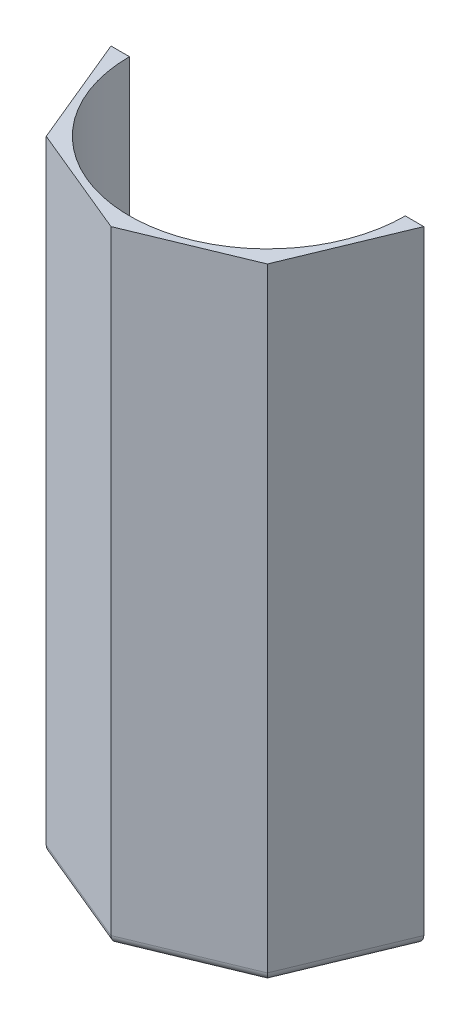
ISO-10303-21;
HEADER;
FILE_DESCRIPTION(('STEP AP214'),'2;1');
FILE_NAME('part.step','',(''),(''),'','','');
FILE_SCHEMA(('AUTOMOTIVE_DESIGN { 1 0 10303 214 1 1 1 1 }'));
ENDSEC;
DATA;
#1=APPLICATION_CONTEXT('core data for automotive mechanical design processes');
#2=APPLICATION_PROTOCOL_DEFINITION('international standard','automotive_design',2000,#1);
#3=PRODUCT_CONTEXT('',#1,'mechanical');
#4=PRODUCT('Part','Part','',(#3));
#5=PRODUCT_RELATED_PRODUCT_CATEGORY('part','',(#4));
#6=PRODUCT_DEFINITION_FORMATION('','',#4);
#7=PRODUCT_DEFINITION_CONTEXT('part definition',#1,'design');
#8=PRODUCT_DEFINITION('design','',#6,#7);
#9=PRODUCT_DEFINITION_SHAPE('','',#8);
#10=(LENGTH_UNIT() NAMED_UNIT(*) SI_UNIT(.MILLI.,.METRE.));
#11=(NAMED_UNIT(*) PLANE_ANGLE_UNIT() SI_UNIT($,.RADIAN.));
#12=(NAMED_UNIT(*) SI_UNIT($,.STERADIAN.) SOLID_ANGLE_UNIT());
#13=UNCERTAINTY_MEASURE_WITH_UNIT(LENGTH_MEASURE(1.E-05),#10,'distance_accuracy_value','');
#14=(GEOMETRIC_REPRESENTATION_CONTEXT(3) GLOBAL_UNCERTAINTY_ASSIGNED_CONTEXT((#13)) GLOBAL_UNIT_ASSIGNED_CONTEXT((#10,
#11,#12)) REPRESENTATION_CONTEXT('',''));
#15=CARTESIAN_POINT('',(0.,0.,0.));
#16=DIRECTION('',(0.,0.,1.));
#17=DIRECTION('',(1.,0.,0.));
#18=AXIS2_PLACEMENT_3D('',#15,#16,#17);
#19=CARTESIAN_POINT('',(24.8548033587074,140.,24.8548033587069));
#20=DIRECTION('',(-0.923879532511291,0.,-0.382683432365079));
#21=DIRECTION('',(-0.382683432365079,0.,0.923879532511291));
#22=AXIS2_PLACEMENT_3D('',#19,#20,#21);
#23=PLANE('',#22);
#24=DIRECTION('',(0.,-1.,0.));
#25=VECTOR('',#24,1.);
#26=CARTESIAN_POINT('',(24.8548033587074,140.,24.8548033587069));
#27=LINE('',#26,#25);
#28=CARTESIAN_POINT('',(24.8548033587074,140.,24.8548033587069));
#29=VERTEX_POINT('',#28);
#30=CARTESIAN_POINT('',(24.8548033587074,2.,24.8548033587069));
#31=VERTEX_POINT('',#30);
#32=EDGE_CURVE('E151',#29,#31,#27,.T.);
#33=ORIENTED_EDGE('',*,*,#32,.T.);
#34=DIRECTION('',(0.382683432365079,0.,-0.923879532511291));
#35=VECTOR('',#34,1.);
#36=CARTESIAN_POINT('',(24.8548033587074,2.,24.8548033587069));
#37=LINE('',#36,#35);
#38=CARTESIAN_POINT('',(35.15,2.,-4.05925293378573E-13));
#39=VERTEX_POINT('',#38);
#40=EDGE_CURVE('E176',#31,#39,#37,.T.);
#41=ORIENTED_EDGE('',*,*,#40,.T.);
#42=DIRECTION('',(0.,-1.,0.));
#43=VECTOR('',#42,1.);
#44=CARTESIAN_POINT('',(35.15,140.,-4.05925293378573E-13));
#45=LINE('',#44,#43);
#46=CARTESIAN_POINT('',(35.15,140.,-4.05925293378573E-13));
#47=VERTEX_POINT('',#46);
#48=EDGE_CURVE('E56',#47,#39,#45,.T.);
#49=ORIENTED_EDGE('',*,*,#48,.F.);
#50=DIRECTION('',(0.382683432365079,0.,-0.923879532511291));
#51=VECTOR('',#50,1.);
#52=CARTESIAN_POINT('',(24.8548033587074,140.,24.8548033587069));
#53=LINE('',#52,#51);
#54=EDGE_CURVE('E141',#29,#47,#53,.T.);
#55=ORIENTED_EDGE('',*,*,#54,.F.);
#56=EDGE_LOOP('',(#33,#41,#49,#55));
#57=FACE_BOUND('',#56,.T.);
#58=ADVANCED_FACE('F33',(#57),#23,.F.);
#59=CARTESIAN_POINT('',(-35.15,140.,3.9676378502107E-13));
#60=DIRECTION('',(0.923879532511282,0.,-0.3826834323651));
#61=DIRECTION('',(-0.3826834323651,0.,-0.923879532511282));
#62=AXIS2_PLACEMENT_3D('',#59,#60,#61);
#63=PLANE('',#62);
#64=DIRECTION('',(0.,-1.,0.));
#65=VECTOR('',#64,1.);
#66=CARTESIAN_POINT('',(-35.15,140.,3.9676378502107E-13));
#67=LINE('',#66,#65);
#68=CARTESIAN_POINT('',(-35.15,140.,3.9676378502107E-13));
#69=VERTEX_POINT('',#68);
#70=CARTESIAN_POINT('',(-35.15,2.,3.96815807153772E-13));
#71=VERTEX_POINT('',#70);
#72=EDGE_CURVE('E119',#69,#71,#67,.T.);
#73=ORIENTED_EDGE('',*,*,#72,.T.);
#74=DIRECTION('',(0.3826834323651,0.,0.923879532511282));
#75=VECTOR('',#74,1.);
#76=CARTESIAN_POINT('',(-35.15,2.,3.9676378502107E-13));
#77=LINE('',#76,#75);
#78=CARTESIAN_POINT('',(-24.8548033587068,2.,24.8548033587074));
#79=VERTEX_POINT('',#78);
#80=EDGE_CURVE('E11',#71,#79,#77,.T.);
#81=ORIENTED_EDGE('',*,*,#80,.T.);
#82=DIRECTION('',(0.,-1.,0.));
#83=VECTOR('',#82,1.);
#84=CARTESIAN_POINT('',(-24.8548033587068,140.,24.8548033587074));
#85=LINE('',#84,#83);
#86=CARTESIAN_POINT('',(-24.8548033587068,140.,24.8548033587074));
#87=VERTEX_POINT('',#86);
#88=EDGE_CURVE('E126',#87,#79,#85,.T.);
#89=ORIENTED_EDGE('',*,*,#88,.F.);
#90=DIRECTION('',(0.3826834323651,0.,0.923879532511282));
#91=VECTOR('',#90,1.);
#92=CARTESIAN_POINT('',(-35.15,140.,3.9676378502107E-13));
#93=LINE('',#92,#91);
#94=EDGE_CURVE('E131',#69,#87,#93,.T.);
#95=ORIENTED_EDGE('',*,*,#94,.F.);
#96=EDGE_LOOP('',(#73,#81,#89,#95));
#97=FACE_BOUND('',#96,.T.);
#98=ADVANCED_FACE('F138',(#97),#63,.F.);
#99=CARTESIAN_POINT('',(-24.8548033587068,140.,24.8548033587074));
#100=DIRECTION('',(0.382683432365079,0.,-0.923879532511291));
#101=DIRECTION('',(-0.923879532511291,0.,-0.382683432365079));
#102=AXIS2_PLACEMENT_3D('',#99,#100,#101);
#103=PLANE('',#102);
#104=ORIENTED_EDGE('',*,*,#88,.T.);
#105=DIRECTION('',(0.923879532511291,0.,0.382683432365079));
#106=VECTOR('',#105,1.);
#107=CARTESIAN_POINT('',(-24.8548033587068,2.,24.8548033587074));
#108=LINE('',#107,#106);
#109=CARTESIAN_POINT('',(4.02455846426619E-13,2.,35.15));
#110=VERTEX_POINT('',#109);
#111=EDGE_CURVE('E42',#79,#110,#108,.T.);
#112=ORIENTED_EDGE('',*,*,#111,.T.);
#113=DIRECTION('',(0.,-1.,0.));
#114=VECTOR('',#113,1.);
#115=CARTESIAN_POINT('',(4.02455846426619E-13,140.,35.15));
#116=LINE('',#115,#114);
#117=CARTESIAN_POINT('',(4.02455846426619E-13,140.,35.15));
#118=VERTEX_POINT('',#117);
#119=EDGE_CURVE('E154',#118,#110,#116,.T.);
#120=ORIENTED_EDGE('',*,*,#119,.F.);
#121=DIRECTION('',(0.923879532511291,0.,0.382683432365079));
#122=VECTOR('',#121,1.);
#123=CARTESIAN_POINT('',(-24.8548033587068,140.,24.8548033587074));
#124=LINE('',#123,#122);
#125=EDGE_CURVE('E140',#87,#118,#124,.T.);
#126=ORIENTED_EDGE('',*,*,#125,.F.);
#127=EDGE_LOOP('',(#104,#112,#120,#126));
#128=FACE_BOUND('',#127,.T.);
#129=ADVANCED_FACE('F243',(#128),#103,.F.);
#130=CARTESIAN_POINT('',(4.02455846426619E-13,140.,35.15));
#131=DIRECTION('',(-0.3826834323651,0.,-0.923879532511283));
#132=DIRECTION('',(-0.923879532511283,0.,0.3826834323651));
#133=AXIS2_PLACEMENT_3D('',#130,#131,#132);
#134=PLANE('',#133);
#135=ORIENTED_EDGE('',*,*,#119,.T.);
#136=DIRECTION('',(0.923879532511283,0.,-0.3826834323651));
#137=VECTOR('',#136,1.);
#138=CARTESIAN_POINT('',(4.02455846426619E-13,2.,35.15));
#139=LINE('',#138,#137);
#140=EDGE_CURVE('E159',#110,#31,#139,.T.);
#141=ORIENTED_EDGE('',*,*,#140,.T.);
#142=ORIENTED_EDGE('',*,*,#32,.F.);
#143=DIRECTION('',(0.923879532511283,0.,-0.3826834323651));
#144=VECTOR('',#143,1.);
#145=CARTESIAN_POINT('',(4.02455846426619E-13,140.,35.15));
#146=LINE('',#145,#144);
#147=EDGE_CURVE('E143',#118,#29,#146,.T.);
#148=ORIENTED_EDGE('',*,*,#147,.F.);
#149=EDGE_LOOP('',(#135,#141,#142,#148));
#150=FACE_BOUND('',#149,.T.);
#151=ADVANCED_FACE('F294',(#150),#134,.F.);
#152=CARTESIAN_POINT('',(0.,140.,0.));
#153=DIRECTION('',(0.,1.,0.));
#154=DIRECTION('',(0.,0.,1.));
#155=AXIS2_PLACEMENT_3D('',#152,#153,#154);
#156=PLANE('',#155);
#157=DIRECTION('',(1.,0.,0.));
#158=VECTOR('',#157,1.);
#159=CARTESIAN_POINT('',(-35.15,140.,3.9676378502107E-13));
#160=LINE('',#159,#158);
#161=CARTESIAN_POINT('',(-31.,140.,3.49378867875146E-13));
#162=VERTEX_POINT('',#161);
#163=EDGE_CURVE('E122',#69,#162,#160,.T.);
#164=ORIENTED_EDGE('',*,*,#163,.F.);
#165=ORIENTED_EDGE('',*,*,#94,.T.);
#166=ORIENTED_EDGE('',*,*,#125,.T.);
#167=ORIENTED_EDGE('',*,*,#147,.T.);
#168=ORIENTED_EDGE('',*,*,#54,.T.);
#169=CARTESIAN_POINT('',(31.,140.,-3.58540376232648E-13));
#170=VERTEX_POINT('',#169);
#171=EDGE_CURVE('E136',#170,#47,#160,.T.);
#172=ORIENTED_EDGE('',*,*,#171,.F.);
#173=CARTESIAN_POINT('',(0.,140.,0.));
#174=DIRECTION('',(0.,1.,0.));
#175=DIRECTION('',(0.,0.,1.));
#176=AXIS2_PLACEMENT_3D('',#173,#174,#175);
#177=CIRCLE('',#176,31.);
#178=EDGE_CURVE('E134',#162,#170,#177,.T.);
#179=ORIENTED_EDGE('',*,*,#178,.F.);
#180=EDGE_LOOP('',(#164,#165,#166,#167,#168,#172,#179));
#181=FACE_BOUND('',#180,.T.);
#182=ADVANCED_FACE('F130',(#181),#156,.T.);
#183=CARTESIAN_POINT('',(0.,0.,0.));
#184=DIRECTION('',(0.,1.,0.));
#185=DIRECTION('',(0.,0.,1.));
#186=AXIS2_PLACEMENT_3D('',#183,#184,#185);
#187=PLANE('',#186);
#188=DIRECTION('',(0.3826834323651,0.,0.923879532511282));
#189=VECTOR('',#188,1.);
#190=CARTESIAN_POINT('',(-28.1546426143309,0.,11.6620348146237));
#191=LINE('',#190,#189);
#192=CARTESIAN_POINT('',(-23.3240696292465,0.,23.3240696292471));
#193=VERTEX_POINT('',#192);
#194=CARTESIAN_POINT('',(-32.9852155994152,0.,3.68518255460775E-13));
#195=VERTEX_POINT('',#194);
#196=EDGE_CURVE('E166',#193,#195,#191,.F.);
#197=ORIENTED_EDGE('',*,*,#196,.T.);
#198=DIRECTION('',(1.,0.,0.));
#199=VECTOR('',#198,1.);
#200=CARTESIAN_POINT('',(0.,0.,0.));
#201=LINE('',#200,#199);
#202=CARTESIAN_POINT('',(-26.,0.,2.92288606253549E-13));
#203=VERTEX_POINT('',#202);
#204=EDGE_CURVE('E214',#195,#203,#201,.T.);
#205=ORIENTED_EDGE('',*,*,#204,.T.);
#206=CARTESIAN_POINT('',(0.,0.,0.));
#207=DIRECTION('',(0.,-1.,0.));
#208=DIRECTION('',(0.,0.,-1.));
#209=AXIS2_PLACEMENT_3D('',#206,#207,#208);
#210=CIRCLE('',#209,26.);
#211=CARTESIAN_POINT('',(26.,0.,-3.01450114611052E-13));
#212=VERTEX_POINT('',#211);
#213=EDGE_CURVE('E163',#212,#203,#210,.T.);
#214=ORIENTED_EDGE('',*,*,#213,.F.);
#215=CARTESIAN_POINT('',(32.9852155994152,0.,-3.81639164714898E-13));
#216=VERTEX_POINT('',#215);
#217=EDGE_CURVE('E135',#212,#216,#201,.T.);
#218=ORIENTED_EDGE('',*,*,#217,.T.);
#219=DIRECTION('',(0.382683432365079,0.,-0.923879532511291));
#220=VECTOR('',#219,1.);
#221=CARTESIAN_POINT('',(28.1546426143311,0.,11.6620348146231));
#222=LINE('',#221,#220);
#223=CARTESIAN_POINT('',(23.324069629247,0.,23.3240696292465));
#224=VERTEX_POINT('',#223);
#225=EDGE_CURVE('E171',#216,#224,#222,.F.);
#226=ORIENTED_EDGE('',*,*,#225,.T.);
#227=DIRECTION('',(0.923879532511283,0.,-0.3826834323651));
#228=VECTOR('',#227,1.);
#229=CARTESIAN_POINT('',(11.6620348146237,0.,28.1546426143309));
#230=LINE('',#229,#228);
#231=CARTESIAN_POINT('',(3.72435469328393E-13,0.,32.9852155994152));
#232=VERTEX_POINT('',#231);
#233=EDGE_CURVE('E173',#224,#232,#230,.F.);
#234=ORIENTED_EDGE('',*,*,#233,.T.);
#235=DIRECTION('',(0.923879532511291,0.,0.382683432365079));
#236=VECTOR('',#235,1.);
#237=CARTESIAN_POINT('',(-11.6620348146231,0.,28.1546426143311));
#238=LINE('',#237,#236);
#239=EDGE_CURVE('E169',#232,#193,#238,.F.);
#240=ORIENTED_EDGE('',*,*,#239,.T.);
#241=EDGE_LOOP('',(#197,#205,#214,#218,#226,#234,#240));
#242=FACE_BOUND('',#241,.T.);
#243=ADVANCED_FACE('F224',(#242),#187,.F.);
#244=CARTESIAN_POINT('',(0.,6.50000000000001,0.));
#245=DIRECTION('',(0.,1.,0.));
#246=DIRECTION('',(0.,0.,1.));
#247=AXIS2_PLACEMENT_3D('',#244,#245,#246);
#248=CYLINDRICAL_SURFACE('',#247,31.);
#249=ORIENTED_EDGE('',*,*,#178,.T.);
#250=DIRECTION('',(0.,1.,0.));
#251=VECTOR('',#250,1.);
#252=CARTESIAN_POINT('',(31.,6.50000000000001,-3.58540376232648E-13));
#253=LINE('',#252,#251);
#254=CARTESIAN_POINT('',(31.,6.50000000000001,-3.58540376232648E-13));
#255=VERTEX_POINT('',#254);
#256=EDGE_CURVE('E208',#170,#255,#253,.F.);
#257=ORIENTED_EDGE('',*,*,#256,.T.);
#258=CARTESIAN_POINT('',(0.,6.50000000000001,0.));
#259=DIRECTION('',(0.,1.,0.));
#260=DIRECTION('',(0.,0.,1.));
#261=AXIS2_PLACEMENT_3D('',#258,#259,#260);
#262=CIRCLE('',#261,31.);
#263=CARTESIAN_POINT('',(-31.,6.50000000000001,3.49378867875146E-13));
#264=VERTEX_POINT('',#263);
#265=EDGE_CURVE('E146',#264,#255,#262,.T.);
#266=ORIENTED_EDGE('',*,*,#265,.F.);
#267=DIRECTION('',(0.,1.,0.));
#268=VECTOR('',#267,1.);
#269=CARTESIAN_POINT('',(-31.,6.50000000000001,3.49378867875146E-13));
#270=LINE('',#269,#268);
#271=EDGE_CURVE('E182',#264,#162,#270,.T.);
#272=ORIENTED_EDGE('',*,*,#271,.T.);
#273=EDGE_LOOP('',(#249,#257,#266,#272));
#274=FACE_BOUND('',#273,.T.);
#275=ADVANCED_FACE('F206',(#274),#248,.F.);
#276=CARTESIAN_POINT('',(0.,6.50000000000001,0.));
#277=DIRECTION('',(0.,1.,0.));
#278=DIRECTION('',(0.,0.,1.));
#279=AXIS2_PLACEMENT_3D('',#276,#277,#278);
#280=PLANE('',#279);
#281=DIRECTION('',(1.,0.,0.));
#282=VECTOR('',#281,1.);
#283=CARTESIAN_POINT('',(0.,6.50000000000001,0.));
#284=LINE('',#283,#282);
#285=CARTESIAN_POINT('',(-26.,6.50000000000001,2.92288606253549E-13));
#286=VERTEX_POINT('',#285);
#287=EDGE_CURVE('E210',#264,#286,#284,.T.);
#288=ORIENTED_EDGE('',*,*,#287,.F.);
#289=ORIENTED_EDGE('',*,*,#265,.T.);
#290=CARTESIAN_POINT('',(26.,6.50000000000001,-3.01450114611052E-13));
#291=VERTEX_POINT('',#290);
#292=EDGE_CURVE('E213',#291,#255,#284,.T.);
#293=ORIENTED_EDGE('',*,*,#292,.F.);
#294=CARTESIAN_POINT('',(0.,6.50000000000001,0.));
#295=DIRECTION('',(0.,1.,0.));
#296=DIRECTION('',(0.,0.,1.));
#297=AXIS2_PLACEMENT_3D('',#294,#295,#296);
#298=CIRCLE('',#297,26.);
#299=EDGE_CURVE('E160',#286,#291,#298,.T.);
#300=ORIENTED_EDGE('',*,*,#299,.F.);
#301=EDGE_LOOP('',(#288,#289,#293,#300));
#302=FACE_BOUND('',#301,.T.);
#303=ADVANCED_FACE('F228',(#302),#280,.T.);
#304=CARTESIAN_POINT('',(0.,133.5,0.));
#305=DIRECTION('',(0.,-1.,0.));
#306=DIRECTION('',(0.,0.,-1.));
#307=AXIS2_PLACEMENT_3D('',#304,#305,#306);
#308=CYLINDRICAL_SURFACE('',#307,26.);
#309=ORIENTED_EDGE('',*,*,#213,.T.);
#310=DIRECTION('',(0.,-1.,0.));
#311=VECTOR('',#310,1.);
#312=CARTESIAN_POINT('',(-26.,133.5,2.92288606253549E-13));
#313=LINE('',#312,#311);
#314=EDGE_CURVE('E211',#203,#286,#313,.F.);
#315=ORIENTED_EDGE('',*,*,#314,.T.);
#316=ORIENTED_EDGE('',*,*,#299,.T.);
#317=DIRECTION('',(0.,-1.,0.));
#318=VECTOR('',#317,1.);
#319=CARTESIAN_POINT('',(26.,133.5,-3.01450114611052E-13));
#320=LINE('',#319,#318);
#321=EDGE_CURVE('E217',#291,#212,#320,.T.);
#322=ORIENTED_EDGE('',*,*,#321,.T.);
#323=EDGE_LOOP('',(#309,#315,#316,#322));
#324=FACE_BOUND('',#323,.T.);
#325=ADVANCED_FACE('F226',(#324),#308,.F.);
#326=CARTESIAN_POINT('',(-33.3022409349774,2.,-0.765366864729804));
#327=DIRECTION('',(0.3826834323651,0.,0.923879532511282));
#328=DIRECTION('',(0.923879532511282,0.,-0.3826834323651));
#329=AXIS2_PLACEMENT_3D('',#326,#327,#328);
#330=CYLINDRICAL_SURFACE('',#329,2.);
#331=CARTESIAN_POINT('',(-32.9852155994152,2.,3.67869797124332E-13));
#332=DIRECTION('',(0.,0.,1.));
#333=DIRECTION('',(1.,0.,0.));
#334=AXIS2_PLACEMENT_3D('',#331,#332,#333);
#335=ELLIPSE('',#334,2.16478440058479,2.);
#336=EDGE_CURVE('E37',#71,#195,#335,.T.);
#337=ORIENTED_EDGE('',*,*,#336,.T.);
#338=ORIENTED_EDGE('',*,*,#196,.F.);
#339=CARTESIAN_POINT('',(-23.3240696292465,2.,23.3240696292471));
#340=DIRECTION('',(0.707106781186556,0.,0.707106781186539));
#341=DIRECTION('',(-0.707106781186539,0.,0.707106781186556));
#342=AXIS2_PLACEMENT_3D('',#339,#340,#341);
#343=ELLIPSE('',#342,2.16478440058479,2.);
#344=EDGE_CURVE('E186',#79,#193,#343,.T.);
#345=ORIENTED_EDGE('',*,*,#344,.F.);
#346=ORIENTED_EDGE('',*,*,#80,.F.);
#347=EDGE_LOOP('',(#337,#338,#345,#346));
#348=FACE_BOUND('',#347,.T.);
#349=ADVANCED_FACE('F35',(#348),#330,.T.);
#350=CARTESIAN_POINT('',(-24.0894364939767,2.,23.0070442936849));
#351=DIRECTION('',(0.923879532511291,0.,0.382683432365079));
#352=DIRECTION('',(0.382683432365079,0.,-0.923879532511291));
#353=AXIS2_PLACEMENT_3D('',#350,#351,#352);
#354=CYLINDRICAL_SURFACE('',#353,2.);
#355=ORIENTED_EDGE('',*,*,#344,.T.);
#356=ORIENTED_EDGE('',*,*,#239,.F.);
#357=CARTESIAN_POINT('',(3.7811550765432E-13,2.,32.9852155994152));
#358=DIRECTION('',(1.,0.,0.));
#359=DIRECTION('',(0.,0.,1.));
#360=AXIS2_PLACEMENT_3D('',#357,#358,#359);
#361=ELLIPSE('',#360,2.16478440058479,2.);
#362=EDGE_CURVE('E181',#110,#232,#361,.T.);
#363=ORIENTED_EDGE('',*,*,#362,.F.);
#364=ORIENTED_EDGE('',*,*,#111,.F.);
#365=EDGE_LOOP('',(#355,#356,#363,#364));
#366=FACE_BOUND('',#365,.T.);
#367=ADVANCED_FACE('F254',(#366),#354,.T.);
#368=CARTESIAN_POINT('',(23.0070442936848,2.,24.0894364939767));
#369=DIRECTION('',(0.382683432365079,0.,-0.923879532511291));
#370=DIRECTION('',(-0.923879532511291,0.,-0.382683432365079));
#371=AXIS2_PLACEMENT_3D('',#368,#369,#370);
#372=CYLINDRICAL_SURFACE('',#371,2.);
#373=CARTESIAN_POINT('',(32.9852155994152,2.,-3.8369914884262E-13));
#374=DIRECTION('',(0.,0.,-1.));
#375=DIRECTION('',(-1.,0.,0.));
#376=AXIS2_PLACEMENT_3D('',#373,#374,#375);
#377=ELLIPSE('',#376,2.16478440058479,2.);
#378=EDGE_CURVE('E184',#216,#39,#377,.F.);
#379=ORIENTED_EDGE('',*,*,#378,.T.);
#380=ORIENTED_EDGE('',*,*,#40,.F.);
#381=CARTESIAN_POINT('',(23.324069629247,2.,23.3240696292465));
#382=DIRECTION('',(0.707106781186539,0.,-0.707106781186556));
#383=DIRECTION('',(-0.707106781186556,0.,-0.707106781186539));
#384=AXIS2_PLACEMENT_3D('',#381,#382,#383);
#385=ELLIPSE('',#384,2.16478440058479,2.);
#386=EDGE_CURVE('E179',#224,#31,#385,.F.);
#387=ORIENTED_EDGE('',*,*,#386,.F.);
#388=ORIENTED_EDGE('',*,*,#225,.F.);
#389=EDGE_LOOP('',(#379,#380,#387,#388));
#390=FACE_BOUND('',#389,.T.);
#391=ADVANCED_FACE('F251',(#390),#372,.T.);
#392=CARTESIAN_POINT('',(-0.765366864729797,2.,33.3022409349774));
#393=DIRECTION('',(0.923879532511283,0.,-0.3826834323651));
#394=DIRECTION('',(-0.3826834323651,0.,-0.923879532511283));
#395=AXIS2_PLACEMENT_3D('',#392,#393,#394);
#396=CYLINDRICAL_SURFACE('',#395,2.);
#397=ORIENTED_EDGE('',*,*,#362,.T.);
#398=ORIENTED_EDGE('',*,*,#233,.F.);
#399=ORIENTED_EDGE('',*,*,#386,.T.);
#400=ORIENTED_EDGE('',*,*,#140,.F.);
#401=EDGE_LOOP('',(#397,#398,#399,#400));
#402=FACE_BOUND('',#401,.T.);
#403=ADVANCED_FACE('F247',(#402),#396,.T.);
#404=CARTESIAN_POINT('',(-35.15,-33.5,3.9676378502107E-13));
#405=DIRECTION('',(0.,0.,1.));
#406=DIRECTION('',(1.,0.,0.));
#407=AXIS2_PLACEMENT_3D('',#404,#405,#406);
#408=PLANE('',#407);
#409=ORIENTED_EDGE('',*,*,#171,.T.);
#410=ORIENTED_EDGE('',*,*,#48,.T.);
#411=ORIENTED_EDGE('',*,*,#378,.F.);
#412=ORIENTED_EDGE('',*,*,#217,.F.);
#413=ORIENTED_EDGE('',*,*,#321,.F.);
#414=ORIENTED_EDGE('',*,*,#292,.T.);
#415=ORIENTED_EDGE('',*,*,#256,.F.);
#416=EDGE_LOOP('',(#409,#410,#411,#412,#413,#414,#415));
#417=FACE_BOUND('',#416,.T.);
#418=ADVANCED_FACE('F250',(#417),#408,.F.);
#419=ORIENTED_EDGE('',*,*,#287,.T.);
#420=ORIENTED_EDGE('',*,*,#314,.F.);
#421=ORIENTED_EDGE('',*,*,#204,.F.);
#422=ORIENTED_EDGE('',*,*,#336,.F.);
#423=ORIENTED_EDGE('',*,*,#72,.F.);
#424=ORIENTED_EDGE('',*,*,#163,.T.);
#425=ORIENTED_EDGE('',*,*,#271,.F.);
#426=EDGE_LOOP('',(#419,#420,#421,#422,#423,#424,#425));
#427=FACE_BOUND('',#426,.T.);
#428=ADVANCED_FACE('F121',(#427),#408,.F.);
#429=CLOSED_SHELL('',(#58,#98,#129,#151,#182,#243,#275,#303,#325,#349,#367,#391,#403,#418,#428));
#430=MANIFOLD_SOLID_BREP('B2',#429);
#431=ADVANCED_BREP_SHAPE_REPRESENTATION('',(#18,#430),#14);
#432=SHAPE_DEFINITION_REPRESENTATION(#9,#431);
ENDSEC;
END-ISO-10303-21;
